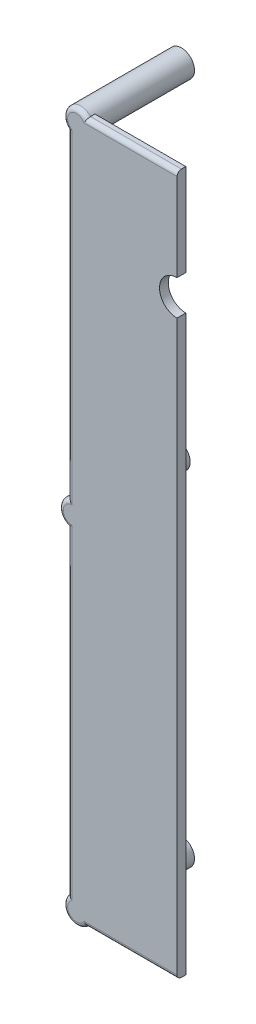
ISO-10303-21;
HEADER;
FILE_DESCRIPTION(('STEP AP214'),'2;1');
FILE_NAME('part.step','',(''),(''),'','','');
FILE_SCHEMA(('AUTOMOTIVE_DESIGN { 1 0 10303 214 1 1 1 1 }'));
ENDSEC;
DATA;
#1=APPLICATION_CONTEXT('core data for automotive mechanical design processes');
#2=APPLICATION_PROTOCOL_DEFINITION('international standard','automotive_design',2000,#1);
#3=PRODUCT_CONTEXT('',#1,'mechanical');
#4=PRODUCT('Part','Part','',(#3));
#5=PRODUCT_RELATED_PRODUCT_CATEGORY('part','',(#4));
#6=PRODUCT_DEFINITION_FORMATION('','',#4);
#7=PRODUCT_DEFINITION_CONTEXT('part definition',#1,'design');
#8=PRODUCT_DEFINITION('design','',#6,#7);
#9=PRODUCT_DEFINITION_SHAPE('','',#8);
#10=(LENGTH_UNIT() NAMED_UNIT(*) SI_UNIT(.MILLI.,.METRE.));
#11=(NAMED_UNIT(*) PLANE_ANGLE_UNIT() SI_UNIT($,.RADIAN.));
#12=(NAMED_UNIT(*) SI_UNIT($,.STERADIAN.) SOLID_ANGLE_UNIT());
#13=UNCERTAINTY_MEASURE_WITH_UNIT(LENGTH_MEASURE(1.E-05),#10,'distance_accuracy_value','');
#14=(GEOMETRIC_REPRESENTATION_CONTEXT(3) GLOBAL_UNCERTAINTY_ASSIGNED_CONTEXT((#13)) GLOBAL_UNIT_ASSIGNED_CONTEXT((#10,
#11,#12)) REPRESENTATION_CONTEXT('',''));
#15=CARTESIAN_POINT('',(0.,0.,0.));
#16=DIRECTION('',(0.,0.,1.));
#17=DIRECTION('',(1.,0.,0.));
#18=AXIS2_PLACEMENT_3D('',#15,#16,#17);
#19=CARTESIAN_POINT('',(2.,2.,50.));
#20=DIRECTION('',(0.,0.,1.));
#21=DIRECTION('',(1.,0.,0.));
#22=AXIS2_PLACEMENT_3D('',#19,#20,#21);
#23=PLANE('',#22);
#24=DIRECTION('',(0.,1.,0.));
#25=VECTOR('',#24,1.);
#26=CARTESIAN_POINT('',(25.,2.,50.));
#27=LINE('',#26,#25);
#28=CARTESIAN_POINT('',(25.,0.,50.));
#29=VERTEX_POINT('',#28);
#30=CARTESIAN_POINT('',(25.,131.,50.));
#31=VERTEX_POINT('',#30);
#32=EDGE_CURVE('E231',#29,#31,#27,.T.);
#33=ORIENTED_EDGE('',*,*,#32,.F.);
#34=DIRECTION('',(1.,0.,0.));
#35=VECTOR('',#34,1.);
#36=CARTESIAN_POINT('',(0.,0.,50.));
#37=LINE('',#36,#35);
#38=CARTESIAN_POINT('',(4.23606797749979,0.,50.));
#39=VERTEX_POINT('',#38);
#40=EDGE_CURVE('E270',#39,#29,#37,.T.);
#41=ORIENTED_EDGE('',*,*,#40,.F.);
#42=CARTESIAN_POINT('',(2.,2.,50.));
#43=DIRECTION('',(0.,0.,-1.));
#44=DIRECTION('',(-1.,0.,0.));
#45=AXIS2_PLACEMENT_3D('',#42,#43,#44);
#46=CIRCLE('',#45,3.);
#47=CARTESIAN_POINT('',(0.,4.23606797749979,50.));
#48=VERTEX_POINT('',#47);
#49=EDGE_CURVE('E249',#48,#39,#46,.T.);
#50=ORIENTED_EDGE('',*,*,#49,.F.);
#51=DIRECTION('',(0.,-1.,0.));
#52=VECTOR('',#51,1.);
#53=CARTESIAN_POINT('',(0.,0.,50.));
#54=LINE('',#53,#52);
#55=CARTESIAN_POINT('',(0.,77.1715728752538,50.));
#56=VERTEX_POINT('',#55);
#57=EDGE_CURVE('E275',#56,#48,#54,.T.);
#58=ORIENTED_EDGE('',*,*,#57,.F.);
#59=CARTESIAN_POINT('',(0.999999999999973,80.,50.));
#60=DIRECTION('',(0.,0.,-1.));
#61=DIRECTION('',(-1.,0.,0.));
#62=AXIS2_PLACEMENT_3D('',#59,#60,#61);
#63=CIRCLE('',#62,3.);
#64=CARTESIAN_POINT('',(0.,82.8284271247462,50.));
#65=VERTEX_POINT('',#64);
#66=EDGE_CURVE('E258',#65,#56,#63,.T.);
#67=ORIENTED_EDGE('',*,*,#66,.F.);
#68=DIRECTION('',(0.,-1.,0.));
#69=VECTOR('',#68,1.);
#70=CARTESIAN_POINT('',(0.,0.,50.));
#71=LINE('',#70,#69);
#72=CARTESIAN_POINT('',(0.,155.7639320225,50.));
#73=VERTEX_POINT('',#72);
#74=EDGE_CURVE('E278',#73,#65,#71,.T.);
#75=ORIENTED_EDGE('',*,*,#74,.F.);
#76=CARTESIAN_POINT('',(1.99999999999997,158.,50.));
#77=DIRECTION('',(0.,0.,-1.));
#78=DIRECTION('',(-1.,0.,0.));
#79=AXIS2_PLACEMENT_3D('',#76,#77,#78);
#80=CIRCLE('',#79,3.);
#81=CARTESIAN_POINT('',(4.23606797749976,160.,50.));
#82=VERTEX_POINT('',#81);
#83=EDGE_CURVE('E264',#82,#73,#80,.T.);
#84=ORIENTED_EDGE('',*,*,#83,.F.);
#85=DIRECTION('',(-1.,0.,0.));
#86=VECTOR('',#85,1.);
#87=CARTESIAN_POINT('',(0.,160.,50.));
#88=LINE('',#87,#86);
#89=CARTESIAN_POINT('',(25.,160.,50.));
#90=VERTEX_POINT('',#89);
#91=EDGE_CURVE('E281',#90,#82,#88,.T.);
#92=ORIENTED_EDGE('',*,*,#91,.F.);
#93=CARTESIAN_POINT('',(25.,139.,50.));
#94=VERTEX_POINT('',#93);
#95=EDGE_CURVE('E251',#94,#90,#27,.T.);
#96=ORIENTED_EDGE('',*,*,#95,.F.);
#97=CARTESIAN_POINT('',(25.,135.,50.));
#98=DIRECTION('',(0.,0.,1.));
#99=DIRECTION('',(1.,0.,0.));
#100=AXIS2_PLACEMENT_3D('',#97,#98,#99);
#101=CIRCLE('',#100,4.);
#102=EDGE_CURVE('E246',#94,#31,#101,.T.);
#103=ORIENTED_EDGE('',*,*,#102,.T.);
#104=EDGE_LOOP('',(#33,#41,#50,#58,#67,#75,#84,#92,#96,#103));
#105=FACE_BOUND('',#104,.T.);
#106=ADVANCED_FACE('F112',(#105),#23,.F.);
#107=CARTESIAN_POINT('',(2.,2.,52.));
#108=DIRECTION('',(0.,0.,1.));
#109=DIRECTION('',(1.,0.,0.));
#110=AXIS2_PLACEMENT_3D('',#107,#108,#109);
#111=PLANE('',#110);
#112=CARTESIAN_POINT('',(2.,2.,52.));
#113=DIRECTION('',(0.,0.,1.));
#114=DIRECTION('',(1.,0.,0.));
#115=AXIS2_PLACEMENT_3D('',#112,#113,#114);
#116=CIRCLE('',#115,2.);
#117=CARTESIAN_POINT('',(0.999999999999999,3.73205080756888,52.));
#118=VERTEX_POINT('',#117);
#119=CARTESIAN_POINT('',(3.73205080756888,1.,52.));
#120=VERTEX_POINT('',#119);
#121=EDGE_CURVE('E307',#118,#120,#116,.T.);
#122=ORIENTED_EDGE('',*,*,#121,.T.);
#123=DIRECTION('',(1.,0.,0.));
#124=VECTOR('',#123,1.);
#125=CARTESIAN_POINT('',(25.,1.,52.));
#126=LINE('',#125,#124);
#127=CARTESIAN_POINT('',(25.,1.,52.));
#128=VERTEX_POINT('',#127);
#129=EDGE_CURVE('E229',#120,#128,#126,.T.);
#130=ORIENTED_EDGE('',*,*,#129,.T.);
#131=DIRECTION('',(0.,1.,0.));
#132=VECTOR('',#131,1.);
#133=CARTESIAN_POINT('',(25.,2.,52.));
#134=LINE('',#133,#132);
#135=CARTESIAN_POINT('',(25.,131.,52.));
#136=VERTEX_POINT('',#135);
#137=EDGE_CURVE('E222',#128,#136,#134,.T.);
#138=ORIENTED_EDGE('',*,*,#137,.T.);
#139=CARTESIAN_POINT('',(25.,135.,52.));
#140=DIRECTION('',(0.,0.,1.));
#141=DIRECTION('',(1.,0.,0.));
#142=AXIS2_PLACEMENT_3D('',#139,#140,#141);
#143=CIRCLE('',#142,4.);
#144=CARTESIAN_POINT('',(25.,139.,52.));
#145=VERTEX_POINT('',#144);
#146=EDGE_CURVE('E227',#145,#136,#143,.T.);
#147=ORIENTED_EDGE('',*,*,#146,.F.);
#148=CARTESIAN_POINT('',(25.,159.,52.));
#149=VERTEX_POINT('',#148);
#150=EDGE_CURVE('E233',#145,#149,#134,.T.);
#151=ORIENTED_EDGE('',*,*,#150,.T.);
#152=DIRECTION('',(-1.,0.,0.));
#153=VECTOR('',#152,1.);
#154=CARTESIAN_POINT('',(4.23606797749976,159.,52.));
#155=LINE('',#154,#153);
#156=CARTESIAN_POINT('',(3.73205080756885,159.,52.));
#157=VERTEX_POINT('',#156);
#158=EDGE_CURVE('E297',#149,#157,#155,.T.);
#159=ORIENTED_EDGE('',*,*,#158,.T.);
#160=CARTESIAN_POINT('',(1.99999999999997,158.,52.));
#161=DIRECTION('',(0.,0.,1.));
#162=DIRECTION('',(1.,0.,0.));
#163=AXIS2_PLACEMENT_3D('',#160,#161,#162);
#164=CIRCLE('',#163,2.);
#165=CARTESIAN_POINT('',(0.999999999999976,156.267949192431,52.));
#166=VERTEX_POINT('',#165);
#167=EDGE_CURVE('E299',#157,#166,#164,.T.);
#168=ORIENTED_EDGE('',*,*,#167,.T.);
#169=DIRECTION('',(0.,-1.,0.));
#170=VECTOR('',#169,1.);
#171=CARTESIAN_POINT('',(0.999999999999985,82.8284271247462,52.));
#172=LINE('',#171,#170);
#173=CARTESIAN_POINT('',(0.999999999999986,82.,52.));
#174=VERTEX_POINT('',#173);
#175=EDGE_CURVE('E301',#166,#174,#172,.T.);
#176=ORIENTED_EDGE('',*,*,#175,.T.);
#177=CARTESIAN_POINT('',(0.999999999999973,80.,52.));
#178=DIRECTION('',(0.,0.,1.));
#179=DIRECTION('',(1.,0.,0.));
#180=AXIS2_PLACEMENT_3D('',#177,#178,#179);
#181=CIRCLE('',#180,2.);
#182=CARTESIAN_POINT('',(0.999999999999986,78.,52.));
#183=VERTEX_POINT('',#182);
#184=EDGE_CURVE('E303',#174,#183,#181,.T.);
#185=ORIENTED_EDGE('',*,*,#184,.T.);
#186=DIRECTION('',(0.,-1.,0.));
#187=VECTOR('',#186,1.);
#188=CARTESIAN_POINT('',(0.999999999999999,4.23606797749979,52.));
#189=LINE('',#188,#187);
#190=EDGE_CURVE('E305',#183,#118,#189,.T.);
#191=ORIENTED_EDGE('',*,*,#190,.T.);
#192=EDGE_LOOP('',(#122,#130,#138,#147,#151,#159,#168,#176,#185,#191));
#193=FACE_BOUND('',#192,.T.);
#194=ADVANCED_FACE('F224',(#193),#111,.T.);
#195=CARTESIAN_POINT('',(0.,160.,50.));
#196=DIRECTION('',(0.,-1.,0.));
#197=DIRECTION('',(0.,0.,-1.));
#198=AXIS2_PLACEMENT_3D('',#195,#196,#197);
#199=PLANE('',#198);
#200=DIRECTION('',(0.,0.,1.));
#201=VECTOR('',#200,1.);
#202=CARTESIAN_POINT('',(4.23606797749976,160.,0.));
#203=LINE('',#202,#201);
#204=CARTESIAN_POINT('',(4.23606797749976,160.,51.));
#205=VERTEX_POINT('',#204);
#206=EDGE_CURVE('E293',#82,#205,#203,.T.);
#207=ORIENTED_EDGE('',*,*,#206,.T.);
#208=DIRECTION('',(-1.,0.,0.));
#209=VECTOR('',#208,1.);
#210=CARTESIAN_POINT('',(25.,160.,51.));
#211=LINE('',#210,#209);
#212=CARTESIAN_POINT('',(25.,160.,51.));
#213=VERTEX_POINT('',#212);
#214=EDGE_CURVE('E126',#205,#213,#211,.F.);
#215=ORIENTED_EDGE('',*,*,#214,.T.);
#216=DIRECTION('',(0.,0.,1.));
#217=VECTOR('',#216,1.);
#218=CARTESIAN_POINT('',(25.,160.,50.));
#219=LINE('',#218,#217);
#220=EDGE_CURVE('E247',#90,#213,#219,.T.);
#221=ORIENTED_EDGE('',*,*,#220,.F.);
#222=ORIENTED_EDGE('',*,*,#91,.T.);
#223=EDGE_LOOP('',(#207,#215,#221,#222));
#224=FACE_BOUND('',#223,.T.);
#225=ADVANCED_FACE('F397',(#224),#199,.F.);
#226=CARTESIAN_POINT('',(0.,0.,50.));
#227=DIRECTION('',(0.,1.,0.));
#228=DIRECTION('',(0.,0.,1.));
#229=AXIS2_PLACEMENT_3D('',#226,#227,#228);
#230=PLANE('',#229);
#231=DIRECTION('',(0.,0.,-1.));
#232=VECTOR('',#231,1.);
#233=CARTESIAN_POINT('',(25.,0.,50.));
#234=LINE('',#233,#232);
#235=CARTESIAN_POINT('',(25.,0.,51.));
#236=VERTEX_POINT('',#235);
#237=EDGE_CURVE('E453',#236,#29,#234,.T.);
#238=ORIENTED_EDGE('',*,*,#237,.F.);
#239=DIRECTION('',(1.,0.,0.));
#240=VECTOR('',#239,1.);
#241=CARTESIAN_POINT('',(4.23606797749979,0.,51.));
#242=LINE('',#241,#240);
#243=CARTESIAN_POINT('',(4.23606797749979,0.,51.));
#244=VERTEX_POINT('',#243);
#245=EDGE_CURVE('E312',#236,#244,#242,.F.);
#246=ORIENTED_EDGE('',*,*,#245,.T.);
#247=DIRECTION('',(0.,0.,1.));
#248=VECTOR('',#247,1.);
#249=CARTESIAN_POINT('',(4.23606797749979,0.,0.));
#250=LINE('',#249,#248);
#251=EDGE_CURVE('E283',#244,#39,#250,.F.);
#252=ORIENTED_EDGE('',*,*,#251,.T.);
#253=ORIENTED_EDGE('',*,*,#40,.T.);
#254=EDGE_LOOP('',(#238,#246,#252,#253));
#255=FACE_BOUND('',#254,.T.);
#256=ADVANCED_FACE('F416',(#255),#230,.F.);
#257=CARTESIAN_POINT('',(25.,135.,30.));
#258=DIRECTION('',(0.,0.,1.));
#259=DIRECTION('',(1.,0.,0.));
#260=AXIS2_PLACEMENT_3D('',#257,#258,#259);
#261=CYLINDRICAL_SURFACE('',#260,4.);
#262=DIRECTION('',(0.,0.,1.));
#263=VECTOR('',#262,1.);
#264=CARTESIAN_POINT('',(25.,139.,30.));
#265=LINE('',#264,#263);
#266=EDGE_CURVE('E241',#145,#94,#265,.F.);
#267=ORIENTED_EDGE('',*,*,#266,.F.);
#268=ORIENTED_EDGE('',*,*,#146,.T.);
#269=DIRECTION('',(0.,0.,1.));
#270=VECTOR('',#269,1.);
#271=CARTESIAN_POINT('',(25.,131.,30.));
#272=LINE('',#271,#270);
#273=EDGE_CURVE('E235',#31,#136,#272,.T.);
#274=ORIENTED_EDGE('',*,*,#273,.F.);
#275=ORIENTED_EDGE('',*,*,#102,.F.);
#276=EDGE_LOOP('',(#267,#268,#274,#275));
#277=FACE_BOUND('',#276,.T.);
#278=ADVANCED_FACE('F245',(#277),#261,.F.);
#279=CARTESIAN_POINT('',(0.,0.,50.));
#280=DIRECTION('',(1.,0.,0.));
#281=DIRECTION('',(0.,1.,0.));
#282=AXIS2_PLACEMENT_3D('',#279,#280,#281);
#283=PLANE('',#282);
#284=DIRECTION('',(0.,0.,1.));
#285=VECTOR('',#284,1.);
#286=CARTESIAN_POINT('',(0.,82.8284271247462,0.));
#287=LINE('',#286,#285);
#288=CARTESIAN_POINT('',(0.,82.8284271247462,51.));
#289=VERTEX_POINT('',#288);
#290=EDGE_CURVE('E290',#65,#289,#287,.T.);
#291=ORIENTED_EDGE('',*,*,#290,.T.);
#292=DIRECTION('',(0.,-1.,0.));
#293=VECTOR('',#292,1.);
#294=CARTESIAN_POINT('',(0.,155.7639320225,51.));
#295=LINE('',#294,#293);
#296=CARTESIAN_POINT('',(0.,155.7639320225,51.));
#297=VERTEX_POINT('',#296);
#298=EDGE_CURVE('E320',#289,#297,#295,.F.);
#299=ORIENTED_EDGE('',*,*,#298,.T.);
#300=DIRECTION('',(0.,0.,1.));
#301=VECTOR('',#300,1.);
#302=CARTESIAN_POINT('',(0.,155.7639320225,0.));
#303=LINE('',#302,#301);
#304=EDGE_CURVE('E242',#297,#73,#303,.F.);
#305=ORIENTED_EDGE('',*,*,#304,.T.);
#306=ORIENTED_EDGE('',*,*,#74,.T.);
#307=EDGE_LOOP('',(#291,#299,#305,#306));
#308=FACE_BOUND('',#307,.T.);
#309=ADVANCED_FACE('F420',(#308),#283,.F.);
#310=DIRECTION('',(0.,0.,1.));
#311=VECTOR('',#310,1.);
#312=CARTESIAN_POINT('',(0.,4.23606797749979,0.));
#313=LINE('',#312,#311);
#314=CARTESIAN_POINT('',(0.,4.23606797749979,51.));
#315=VERTEX_POINT('',#314);
#316=EDGE_CURVE('E285',#48,#315,#313,.T.);
#317=ORIENTED_EDGE('',*,*,#316,.T.);
#318=DIRECTION('',(0.,-1.,0.));
#319=VECTOR('',#318,1.);
#320=CARTESIAN_POINT('',(0.,77.1715728752538,51.));
#321=LINE('',#320,#319);
#322=CARTESIAN_POINT('',(0.,77.1715728752538,51.));
#323=VERTEX_POINT('',#322);
#324=EDGE_CURVE('E316',#315,#323,#321,.F.);
#325=ORIENTED_EDGE('',*,*,#324,.T.);
#326=DIRECTION('',(0.,0.,1.));
#327=VECTOR('',#326,1.);
#328=CARTESIAN_POINT('',(0.,77.1715728752538,0.));
#329=LINE('',#328,#327);
#330=EDGE_CURVE('E288',#323,#56,#329,.F.);
#331=ORIENTED_EDGE('',*,*,#330,.T.);
#332=ORIENTED_EDGE('',*,*,#57,.T.);
#333=EDGE_LOOP('',(#317,#325,#331,#332));
#334=FACE_BOUND('',#333,.T.);
#335=ADVANCED_FACE('F405',(#334),#283,.F.);
#336=CARTESIAN_POINT('',(2.,2.,0.));
#337=DIRECTION('',(0.,0.,1.));
#338=DIRECTION('',(1.,0.,0.));
#339=AXIS2_PLACEMENT_3D('',#336,#337,#338);
#340=CYLINDRICAL_SURFACE('',#339,3.);
#341=ORIENTED_EDGE('',*,*,#251,.F.);
#342=CARTESIAN_POINT('',(2.,2.,51.));
#343=DIRECTION('',(0.,0.,1.));
#344=DIRECTION('',(1.,0.,0.));
#345=AXIS2_PLACEMENT_3D('',#342,#343,#344);
#346=CIRCLE('',#345,3.);
#347=EDGE_CURVE('E314',#244,#315,#346,.F.);
#348=ORIENTED_EDGE('',*,*,#347,.T.);
#349=ORIENTED_EDGE('',*,*,#316,.F.);
#350=ORIENTED_EDGE('',*,*,#49,.T.);
#351=EDGE_LOOP('',(#341,#348,#349,#350));
#352=FACE_BOUND('',#351,.T.);
#353=CARTESIAN_POINT('',(2.,2.,28.));
#354=DIRECTION('',(0.,0.,-1.));
#355=DIRECTION('',(-1.,0.,0.));
#356=AXIS2_PLACEMENT_3D('',#353,#354,#355);
#357=CIRCLE('',#356,3.);
#358=CARTESIAN_POINT('',(-1.,2.,28.));
#359=VERTEX_POINT('',#358);
#360=EDGE_CURVE('E255',#359,#359,#357,.T.);
#361=ORIENTED_EDGE('',*,*,#360,.F.);
#362=EDGE_LOOP('',(#361));
#363=FACE_BOUND('',#362,.T.);
#364=ADVANCED_FACE('F401',(#352,#363),#340,.T.);
#365=CARTESIAN_POINT('',(0.999999999999973,80.,0.));
#366=DIRECTION('',(0.,0.,1.));
#367=DIRECTION('',(1.,0.,0.));
#368=AXIS2_PLACEMENT_3D('',#365,#366,#367);
#369=CYLINDRICAL_SURFACE('',#368,3.);
#370=ORIENTED_EDGE('',*,*,#330,.F.);
#371=CARTESIAN_POINT('',(0.999999999999973,80.,51.));
#372=DIRECTION('',(0.,0.,1.));
#373=DIRECTION('',(1.,0.,0.));
#374=AXIS2_PLACEMENT_3D('',#371,#372,#373);
#375=CIRCLE('',#374,3.);
#376=EDGE_CURVE('E318',#323,#289,#375,.F.);
#377=ORIENTED_EDGE('',*,*,#376,.T.);
#378=ORIENTED_EDGE('',*,*,#290,.F.);
#379=ORIENTED_EDGE('',*,*,#66,.T.);
#380=EDGE_LOOP('',(#370,#377,#378,#379));
#381=FACE_BOUND('',#380,.T.);
#382=CARTESIAN_POINT('',(0.999999999999973,80.,28.));
#383=DIRECTION('',(0.,0.,-1.));
#384=DIRECTION('',(-1.,0.,0.));
#385=AXIS2_PLACEMENT_3D('',#382,#383,#384);
#386=CIRCLE('',#385,3.);
#387=CARTESIAN_POINT('',(-2.00000000000003,80.,28.));
#388=VERTEX_POINT('',#387);
#389=EDGE_CURVE('E261',#388,#388,#386,.T.);
#390=ORIENTED_EDGE('',*,*,#389,.F.);
#391=EDGE_LOOP('',(#390));
#392=FACE_BOUND('',#391,.T.);
#393=ADVANCED_FACE('F404',(#381,#392),#369,.T.);
#394=CARTESIAN_POINT('',(1.99999999999997,158.,0.));
#395=DIRECTION('',(0.,0.,1.));
#396=DIRECTION('',(1.,0.,0.));
#397=AXIS2_PLACEMENT_3D('',#394,#395,#396);
#398=CYLINDRICAL_SURFACE('',#397,3.);
#399=ORIENTED_EDGE('',*,*,#304,.F.);
#400=CARTESIAN_POINT('',(1.99999999999997,158.,51.));
#401=DIRECTION('',(0.,0.,1.));
#402=DIRECTION('',(1.,0.,0.));
#403=AXIS2_PLACEMENT_3D('',#400,#401,#402);
#404=CIRCLE('',#403,3.);
#405=EDGE_CURVE('E141',#297,#205,#404,.F.);
#406=ORIENTED_EDGE('',*,*,#405,.T.);
#407=ORIENTED_EDGE('',*,*,#206,.F.);
#408=ORIENTED_EDGE('',*,*,#83,.T.);
#409=EDGE_LOOP('',(#399,#406,#407,#408));
#410=FACE_BOUND('',#409,.T.);
#411=CARTESIAN_POINT('',(1.99999999999997,158.,28.));
#412=DIRECTION('',(0.,0.,-1.));
#413=DIRECTION('',(-1.,0.,0.));
#414=AXIS2_PLACEMENT_3D('',#411,#412,#413);
#415=CIRCLE('',#414,3.);
#416=CARTESIAN_POINT('',(-1.00000000000002,158.,28.));
#417=VERTEX_POINT('',#416);
#418=EDGE_CURVE('E267',#417,#417,#415,.T.);
#419=ORIENTED_EDGE('',*,*,#418,.F.);
#420=EDGE_LOOP('',(#419));
#421=FACE_BOUND('',#420,.T.);
#422=ADVANCED_FACE('F409',(#410,#421),#398,.T.);
#423=CARTESIAN_POINT('',(1.99999999999997,158.,28.));
#424=DIRECTION('',(0.,0.,-1.));
#425=DIRECTION('',(-1.,0.,0.));
#426=AXIS2_PLACEMENT_3D('',#423,#424,#425);
#427=PLANE('',#426);
#428=ORIENTED_EDGE('',*,*,#418,.T.);
#429=EDGE_LOOP('',(#428));
#430=FACE_BOUND('',#429,.T.);
#431=ADVANCED_FACE('F413',(#430),#427,.T.);
#432=CARTESIAN_POINT('',(0.999999999999973,80.,28.));
#433=DIRECTION('',(0.,0.,-1.));
#434=DIRECTION('',(-1.,0.,0.));
#435=AXIS2_PLACEMENT_3D('',#432,#433,#434);
#436=PLANE('',#435);
#437=ORIENTED_EDGE('',*,*,#389,.T.);
#438=EDGE_LOOP('',(#437));
#439=FACE_BOUND('',#438,.T.);
#440=ADVANCED_FACE('F467',(#439),#436,.T.);
#441=CARTESIAN_POINT('',(2.,2.,28.));
#442=DIRECTION('',(0.,0.,-1.));
#443=DIRECTION('',(-1.,0.,0.));
#444=AXIS2_PLACEMENT_3D('',#441,#442,#443);
#445=PLANE('',#444);
#446=ORIENTED_EDGE('',*,*,#360,.T.);
#447=EDGE_LOOP('',(#446));
#448=FACE_BOUND('',#447,.T.);
#449=ADVANCED_FACE('F471',(#448),#445,.T.);
#450=CARTESIAN_POINT('',(25.,0.,0.));
#451=DIRECTION('',(1.,0.,0.));
#452=DIRECTION('',(0.,0.,-1.));
#453=AXIS2_PLACEMENT_3D('',#450,#451,#452);
#454=PLANE('',#453);
#455=ORIENTED_EDGE('',*,*,#137,.F.);
#456=CARTESIAN_POINT('',(25.,1.,51.));
#457=DIRECTION('',(1.,0.,0.));
#458=DIRECTION('',(0.,0.,-1.));
#459=AXIS2_PLACEMENT_3D('',#456,#457,#458);
#460=CIRCLE('',#459,1.);
#461=EDGE_CURVE('E310',#128,#236,#460,.T.);
#462=ORIENTED_EDGE('',*,*,#461,.T.);
#463=ORIENTED_EDGE('',*,*,#237,.T.);
#464=ORIENTED_EDGE('',*,*,#32,.T.);
#465=ORIENTED_EDGE('',*,*,#273,.T.);
#466=EDGE_LOOP('',(#455,#462,#463,#464,#465));
#467=FACE_BOUND('',#466,.T.);
#468=ADVANCED_FACE('F236',(#467),#454,.T.);
#469=ORIENTED_EDGE('',*,*,#220,.T.);
#470=CARTESIAN_POINT('',(25.,159.,51.));
#471=DIRECTION('',(1.,0.,0.));
#472=DIRECTION('',(0.,0.,-1.));
#473=AXIS2_PLACEMENT_3D('',#470,#471,#472);
#474=CIRCLE('',#473,1.);
#475=EDGE_CURVE('E13',#213,#149,#474,.T.);
#476=ORIENTED_EDGE('',*,*,#475,.T.);
#477=ORIENTED_EDGE('',*,*,#150,.F.);
#478=ORIENTED_EDGE('',*,*,#266,.T.);
#479=ORIENTED_EDGE('',*,*,#95,.T.);
#480=EDGE_LOOP('',(#469,#476,#477,#478,#479));
#481=FACE_BOUND('',#480,.T.);
#482=ADVANCED_FACE('F388',(#481),#454,.T.);
#483=CARTESIAN_POINT('',(2.,159.,51.));
#484=DIRECTION('',(1.,0.,0.));
#485=DIRECTION('',(0.,0.,-1.));
#486=AXIS2_PLACEMENT_3D('',#483,#484,#485);
#487=CYLINDRICAL_SURFACE('',#486,1.);
#488=ORIENTED_EDGE('',*,*,#475,.F.);
#489=ORIENTED_EDGE('',*,*,#214,.F.);
#490=CARTESIAN_POINT('',(4.23606797749976,160.,51.));
#491=CARTESIAN_POINT('',(4.23606793956587,160.000000958065,51.0262761337896));
#492=CARTESIAN_POINT('',(4.23560453469334,159.998963594621,51.0525391008307));
#493=CARTESIAN_POINT('',(4.23375620885161,159.994832769189,51.1048650273615));
#494=CARTESIAN_POINT('',(4.2323714704562,159.991739714561,51.1309280254427));
#495=CARTESIAN_POINT('',(4.22685627901449,159.979437259157,51.2083830396057));
#496=CARTESIAN_POINT('',(4.22136474999552,159.967204222097,51.2592356513197));
#497=CARTESIAN_POINT('',(4.20690597433165,159.935191179809,51.3579286158092));
#498=CARTESIAN_POINT('',(4.19793957632567,159.915413017284,51.4057697007518));
#499=CARTESIAN_POINT('',(4.17676539644922,159.869097882473,51.4972922287611));
#500=CARTESIAN_POINT('',(4.16455643229231,159.842558445072,51.5409721466976));
#501=CARTESIAN_POINT('',(4.13677011831416,159.78279404117,51.6244598568639));
#502=CARTESIAN_POINT('',(4.12110075664489,159.749388631186,51.6641073334328));
#503=CARTESIAN_POINT('',(4.08698430061042,159.677606331068,51.737208255102));
#504=CARTESIAN_POINT('',(4.06853650693876,159.639228189682,51.7706601360866));
#505=CARTESIAN_POINT('',(4.02764141100471,159.555439589477,51.8333302696355));
#506=CARTESIAN_POINT('',(4.00499171179224,159.509711743303,51.8619910990095));
#507=CARTESIAN_POINT('',(3.95730898884638,159.415244967295,51.9112700455775));
#508=CARTESIAN_POINT('',(3.93227428572005,159.366503924334,51.9318824426384));
#509=CARTESIAN_POINT('',(3.87953296595842,159.265964570219,51.9654804296597));
#510=CARTESIAN_POINT('',(3.85177091316817,159.214118805714,51.9782345742394));
#511=CARTESIAN_POINT('',(3.79467011170553,159.110014229644,51.9953251013182));
#512=CARTESIAN_POINT('',(3.76533436771409,159.057756357059,51.999676977027));
#513=CARTESIAN_POINT('',(3.73431532186289,159.003924167277,51.9999942395109));
#514=CARTESIAN_POINT('',(3.73318345312102,159.001961787951,52.0000000133747));
#515=CARTESIAN_POINT('',(3.73205080756885,159.,52.));
#516=B_SPLINE_CURVE_WITH_KNOTS('',3,(#490,#491,#492,#493,#494,#495,#496,#497,#498,#499,#500,
#501,#502,#503,#504,#505,#506,#507,#508,#509,#510,#511,#512,#513,#514,#515),.UNSPECIFIED.,.F.,
.F.,(4,2,2,2,2,2,2,2,2,2,2,2,4),(0.,0.0787779861353128,0.157540366072871,0.314489126943972,
0.471399581629591,0.628367326863109,0.790160530661868,0.951994524623878,1.12685345558582,
1.30183643600641,1.48175349087446,1.66133847295153,1.66813467263543),.UNSPECIFIED.);
#517=EDGE_CURVE('E117',#157,#205,#516,.F.);
#518=ORIENTED_EDGE('',*,*,#517,.F.);
#519=ORIENTED_EDGE('',*,*,#158,.F.);
#520=EDGE_LOOP('',(#488,#489,#518,#519));
#521=FACE_BOUND('',#520,.T.);
#522=ADVANCED_FACE('F114',(#521),#487,.T.);
#523=CARTESIAN_POINT('',(1.99999999999997,158.,51.));
#524=DIRECTION('',(0.,0.,1.));
#525=DIRECTION('',(1.,0.,0.));
#526=AXIS2_PLACEMENT_3D('',#523,#524,#525);
#527=TOROIDAL_SURFACE('',#526,2.,1.);
#528=ORIENTED_EDGE('',*,*,#517,.T.);
#529=ORIENTED_EDGE('',*,*,#405,.F.);
#530=CARTESIAN_POINT('',(0.,155.7639320225,51.));
#531=CARTESIAN_POINT('',(-9.5806459221234E-07,155.763932060434,51.0262761337896));
#532=CARTESIAN_POINT('',(0.00103640537858079,155.764395465307,51.0525391008307));
#533=CARTESIAN_POINT('',(0.00516723081098938,155.766243791148,51.1048650273615));
#534=CARTESIAN_POINT('',(0.00826028543911742,155.767628529544,51.1309280254427));
#535=CARTESIAN_POINT('',(0.0205627408432936,155.773143720985,51.2083830396057));
#536=CARTESIAN_POINT('',(0.0327957779033056,155.778635250004,51.2592356513197));
#537=CARTESIAN_POINT('',(0.0648088201911056,155.793094025668,51.3579286158092));
#538=CARTESIAN_POINT('',(0.0845869827160169,155.802060423674,51.4057697007518));
#539=CARTESIAN_POINT('',(0.130902117527262,155.823234603551,51.4972922287611));
#540=CARTESIAN_POINT('',(0.157441554927864,155.835443567708,51.5409721466976));
#541=CARTESIAN_POINT('',(0.217205958829783,155.863229881686,51.6244598568639));
#542=CARTESIAN_POINT('',(0.250611368813551,155.878899243355,51.6641073334328));
#543=CARTESIAN_POINT('',(0.322393668932118,155.91301569939,51.737208255102));
#544=CARTESIAN_POINT('',(0.360771810318203,155.931463493061,51.7706601360866));
#545=CARTESIAN_POINT('',(0.444560410522828,155.972358588995,51.8333302696355));
#546=CARTESIAN_POINT('',(0.490288256697313,155.995008288208,51.8619910990095));
#547=CARTESIAN_POINT('',(0.584755032705366,156.042691011154,51.9112700455775));
#548=CARTESIAN_POINT('',(0.633496075665595,156.06772571428,51.9318824426384));
#549=CARTESIAN_POINT('',(0.734035429780546,156.120467034042,51.9654804296597));
#550=CARTESIAN_POINT('',(0.785881194286002,156.148229086832,51.9782345742394));
#551=CARTESIAN_POINT('',(0.889985770355404,156.205329888295,51.9953251013182));
#552=CARTESIAN_POINT('',(0.942243642940566,156.234665632286,51.999676977027));
#553=CARTESIAN_POINT('',(0.996075832722971,156.265684678137,51.9999942395109));
#554=CARTESIAN_POINT('',(0.998038212049448,156.266816546879,52.0000000133747));
#555=CARTESIAN_POINT('',(0.999999999999973,156.267949192431,52.));
#556=B_SPLINE_CURVE_WITH_KNOTS('',3,(#530,#531,#532,#533,#534,#535,#536,#537,#538,#539,#540,
#541,#542,#543,#544,#545,#546,#547,#548,#549,#550,#551,#552,#553,#554,#555),.UNSPECIFIED.,.F.,
.F.,(4,2,2,2,2,2,2,2,2,2,2,2,4),(0.,0.078777986135312,0.157540366072863,0.314489126943977,
0.471399581629592,0.628367326863115,0.790160530661889,0.951994524623866,1.12685345558582,
1.30183643600642,1.48175349087443,1.66133847295156,1.66813467263542),.UNSPECIFIED.);
#557=EDGE_CURVE('E370',#166,#297,#556,.F.);
#558=ORIENTED_EDGE('',*,*,#557,.F.);
#559=ORIENTED_EDGE('',*,*,#167,.F.);
#560=EDGE_LOOP('',(#528,#529,#558,#559));
#561=FACE_BOUND('',#560,.T.);
#562=ADVANCED_FACE('F378',(#561),#527,.T.);
#563=CARTESIAN_POINT('',(1.,2.,51.));
#564=DIRECTION('',(0.,1.,0.));
#565=DIRECTION('',(-1.,0.,0.));
#566=AXIS2_PLACEMENT_3D('',#563,#564,#565);
#567=CYLINDRICAL_SURFACE('',#566,1.);
#568=ORIENTED_EDGE('',*,*,#557,.T.);
#569=ORIENTED_EDGE('',*,*,#298,.F.);
#570=CARTESIAN_POINT('',(0.,82.8284271247462,51.));
#571=CARTESIAN_POINT('',(-1.92209738840747E-06,82.8284278051751,51.0242718999699));
#572=CARTESIAN_POINT('',(0.000884418910799137,82.8278018147085,51.0485307937647));
#573=CARTESIAN_POINT('',(0.00440633423642694,82.8253100695965,51.0968480931946));
#574=CARTESIAN_POINT('',(0.00704124329261334,82.823444786453,51.1209065715564));
#575=CARTESIAN_POINT('',(0.0174885362871063,82.8160382716308,51.1922716291847));
#576=CARTESIAN_POINT('',(0.0278442013467158,82.8086859924729,51.2390520380716));
#577=CARTESIAN_POINT('',(0.0547352458681728,82.7894712423128,51.3297171723663));
#578=CARTESIAN_POINT('',(0.0712640427772848,82.7776135752766,51.3736049238434));
#579=CARTESIAN_POINT('',(0.109655690159153,82.7498308736149,51.4576272846555));
#580=CARTESIAN_POINT('',(0.131523786208559,82.733901838362,51.4977581490814));
#581=CARTESIAN_POINT('',(0.180963156843673,82.6974981043508,51.5756970806461));
#582=CARTESIAN_POINT('',(0.208785496096912,82.6768185769533,51.6132486649265));
#583=CARTESIAN_POINT('',(0.268140979218746,82.6320973387533,51.6829947687106));
#584=CARTESIAN_POINT('',(0.299674772546981,82.6080550393673,51.7151883482418));
#585=CARTESIAN_POINT('',(0.370849807701663,82.5529352093596,51.7789829688021));
#586=CARTESIAN_POINT('',(0.410970252759707,82.5213514243197,51.8096096817468));
#587=CARTESIAN_POINT('',(0.493462649835622,82.4550465492277,51.8636305132498));
#588=CARTESIAN_POINT('',(0.535837764175616,82.4203210021765,51.8870141418967));
#589=CARTESIAN_POINT('',(0.647858637378395,82.3263515895079,51.9390417972051));
#590=CARTESIAN_POINT('',(0.718369711725901,82.2650743851552,51.9621917157338));
#591=CARTESIAN_POINT('',(0.858371372042797,82.1378872683534,51.9925082317313));
#592=CARTESIAN_POINT('',(0.92786270671337,82.0719809839574,51.9996872054044));
#593=CARTESIAN_POINT('',(0.997017805714971,82.0029805374285,51.9999966672879));
#594=CARTESIAN_POINT('',(0.99850935491871,82.0014906552269,52.0000000004368));
#595=CARTESIAN_POINT('',(0.999999999999986,82.,52.));
#596=B_SPLINE_CURVE_WITH_KNOTS('',3,(#570,#571,#572,#573,#574,#575,#576,#577,#578,#579,#580,
#581,#582,#583,#584,#585,#586,#587,#588,#589,#590,#591,#592,#593,#594,#595),.UNSPECIFIED.,.F.,
.F.,(4,2,2,2,2,2,2,2,2,2,2,2,4),(0.,0.0727662358341335,0.145504802842183,0.290141264139484,
0.434623934555044,0.579249126723423,0.731985115133288,0.884747870344661,1.06271769267388,
1.24094407033486,1.52790311157199,1.81463970494203,1.82096426917183),.UNSPECIFIED.);
#597=EDGE_CURVE('E364',#174,#289,#596,.F.);
#598=ORIENTED_EDGE('',*,*,#597,.F.);
#599=ORIENTED_EDGE('',*,*,#175,.F.);
#600=EDGE_LOOP('',(#568,#569,#598,#599));
#601=FACE_BOUND('',#600,.T.);
#602=ADVANCED_FACE('F375',(#601),#567,.T.);
#603=CARTESIAN_POINT('',(0.999999999999973,80.,51.));
#604=DIRECTION('',(0.,0.,1.));
#605=DIRECTION('',(1.,0.,0.));
#606=AXIS2_PLACEMENT_3D('',#603,#604,#605);
#607=TOROIDAL_SURFACE('',#606,2.,1.);
#608=ORIENTED_EDGE('',*,*,#597,.T.);
#609=ORIENTED_EDGE('',*,*,#376,.F.);
#610=CARTESIAN_POINT('',(0.,77.1715728752538,51.));
#611=CARTESIAN_POINT('',(-1.92209738735437E-06,77.1715721948249,51.0242718999699));
#612=CARTESIAN_POINT('',(0.000884418910800257,77.1721981852916,51.0485307937647));
#613=CARTESIAN_POINT('',(0.00440633423642811,77.1746899304035,51.0968480931946));
#614=CARTESIAN_POINT('',(0.00704124329261448,77.176555213547,51.1209065715564));
#615=CARTESIAN_POINT('',(0.0174885362871074,77.1839617283693,51.1922716291847));
#616=CARTESIAN_POINT('',(0.0278442013467167,77.1913140075271,51.2390520380716));
#617=CARTESIAN_POINT('',(0.0547352458681737,77.2105287576872,51.3297171723663));
#618=CARTESIAN_POINT('',(0.0712640427772859,77.2223864247234,51.3736049238434));
#619=CARTESIAN_POINT('',(0.109655690159154,77.2501691263851,51.4576272846555));
#620=CARTESIAN_POINT('',(0.131523786208559,77.266098161638,51.4977581490814));
#621=CARTESIAN_POINT('',(0.180963156843674,77.3025018956492,51.5756970806461));
#622=CARTESIAN_POINT('',(0.208785496096915,77.3231814230468,51.6132486649265));
#623=CARTESIAN_POINT('',(0.26814097921875,77.3679026612467,51.6829947687106));
#624=CARTESIAN_POINT('',(0.299674772546983,77.3919449606327,51.7151883482418));
#625=CARTESIAN_POINT('',(0.370849807701663,77.4470647906404,51.7789829688021));
#626=CARTESIAN_POINT('',(0.410970252759707,77.4786485756803,51.8096096817468));
#627=CARTESIAN_POINT('',(0.493462649835621,77.5449534507723,51.8636305132498));
#628=CARTESIAN_POINT('',(0.535837764175617,77.5796789978235,51.8870141418967));
#629=CARTESIAN_POINT('',(0.647858637378396,77.6736484104921,51.9390417972051));
#630=CARTESIAN_POINT('',(0.718369711725902,77.7349256148448,51.9621917157338));
#631=CARTESIAN_POINT('',(0.858371372042798,77.8621127316467,51.9925082317313));
#632=CARTESIAN_POINT('',(0.92786270671337,77.9280190160426,51.9996872054044));
#633=CARTESIAN_POINT('',(0.997017805714971,77.9970194625715,51.9999966672879));
#634=CARTESIAN_POINT('',(0.998509354918711,77.9985093447731,52.0000000004368));
#635=CARTESIAN_POINT('',(0.999999999999986,78.,52.));
#636=B_SPLINE_CURVE_WITH_KNOTS('',3,(#610,#611,#612,#613,#614,#615,#616,#617,#618,#619,#620,
#621,#622,#623,#624,#625,#626,#627,#628,#629,#630,#631,#632,#633,#634,#635),.UNSPECIFIED.,.F.,
.F.,(4,2,2,2,2,2,2,2,2,2,2,2,4),(0.,0.0727662358341335,0.145504802842183,0.290141264139484,
0.434623934555044,0.579249126723423,0.731985115133289,0.884747870344661,1.06271769267388,
1.24094407033486,1.52790311157199,1.81463970494203,1.82096426917183),.UNSPECIFIED.);
#637=EDGE_CURVE('E357',#183,#323,#636,.F.);
#638=ORIENTED_EDGE('',*,*,#637,.F.);
#639=ORIENTED_EDGE('',*,*,#184,.F.);
#640=EDGE_LOOP('',(#608,#609,#638,#639));
#641=FACE_BOUND('',#640,.T.);
#642=ADVANCED_FACE('F352',(#641),#607,.T.);
#643=CARTESIAN_POINT('',(1.,2.,51.));
#644=DIRECTION('',(0.,1.,0.));
#645=DIRECTION('',(-1.,0.,0.));
#646=AXIS2_PLACEMENT_3D('',#643,#644,#645);
#647=CYLINDRICAL_SURFACE('',#646,1.);
#648=ORIENTED_EDGE('',*,*,#637,.T.);
#649=ORIENTED_EDGE('',*,*,#324,.F.);
#650=CARTESIAN_POINT('',(0.,4.23606797749979,51.));
#651=CARTESIAN_POINT('',(-9.58064564866139E-07,4.23606793956589,51.0262761337896));
#652=CARTESIAN_POINT('',(0.00103640537860743,4.23560453469336,51.0525391008307));
#653=CARTESIAN_POINT('',(0.00516723081101522,4.23375620885164,51.1048650273615));
#654=CARTESIAN_POINT('',(0.00826028543914333,4.23237147045623,51.1309280254427));
#655=CARTESIAN_POINT('',(0.0205627408433198,4.22685627901452,51.2083830396057));
#656=CARTESIAN_POINT('',(0.0327957779033322,4.22136474999555,51.2592356513197));
#657=CARTESIAN_POINT('',(0.0648088201911325,4.20690597433168,51.3579286158092));
#658=CARTESIAN_POINT('',(0.0845869827160441,4.1979395763257,51.4057697007518));
#659=CARTESIAN_POINT('',(0.130902117527289,4.17676539644924,51.4972922287611));
#660=CARTESIAN_POINT('',(0.157441554927891,4.16455643229233,51.5409721466976));
#661=CARTESIAN_POINT('',(0.217205958829809,4.13677011831418,51.6244598568639));
#662=CARTESIAN_POINT('',(0.250611368813578,4.12110075664491,51.6641073334328));
#663=CARTESIAN_POINT('',(0.322393668932146,4.08698430061044,51.737208255102));
#664=CARTESIAN_POINT('',(0.360771810318233,4.06853650693879,51.7706601360866));
#665=CARTESIAN_POINT('',(0.444560410522857,4.02764141100474,51.8333302696355));
#666=CARTESIAN_POINT('',(0.490288256697338,4.00499171179226,51.8619910990095));
#667=CARTESIAN_POINT('',(0.584755032705398,3.9573089888464,51.9112700455775));
#668=CARTESIAN_POINT('',(0.633496075665637,3.93227428572006,51.9318824426384));
#669=CARTESIAN_POINT('',(0.73403542978057,3.87953296595846,51.9654804296597));
#670=CARTESIAN_POINT('',(0.785881194285999,3.85177091316823,51.9782345742394));
#671=CARTESIAN_POINT('',(0.889985770355485,3.79467011170552,51.9953251013182));
#672=CARTESIAN_POINT('',(0.942243642940759,3.76533436771398,51.999676977027));
#673=CARTESIAN_POINT('',(0.996075832722998,3.7343153218629,51.9999942395109));
#674=CARTESIAN_POINT('',(0.998038212049475,3.73318345312104,52.0000000133747));
#675=CARTESIAN_POINT('',(0.999999999999999,3.73205080756888,52.));
#676=B_SPLINE_CURVE_WITH_KNOTS('',3,(#650,#651,#652,#653,#654,#655,#656,#657,#658,#659,#660,
#661,#662,#663,#664,#665,#666,#667,#668,#669,#670,#671,#672,#673,#674,#675),.UNSPECIFIED.,.F.,
.F.,(4,2,2,2,2,2,2,2,2,2,2,2,4),(0.,0.0787779861353122,0.157540366072871,0.314489126943976,
0.471399581629589,0.628367326863117,0.790160530661894,0.951994524623866,1.12685345558582,
1.30183643600642,1.48175349087444,1.66133847295154,1.66813467263542),.UNSPECIFIED.);
#677=EDGE_CURVE('E333',#118,#315,#676,.F.);
#678=ORIENTED_EDGE('',*,*,#677,.F.);
#679=ORIENTED_EDGE('',*,*,#190,.F.);
#680=EDGE_LOOP('',(#648,#649,#678,#679));
#681=FACE_BOUND('',#680,.T.);
#682=ADVANCED_FACE('F346',(#681),#647,.T.);
#683=CARTESIAN_POINT('',(2.,2.,51.));
#684=DIRECTION('',(0.,0.,1.));
#685=DIRECTION('',(1.,0.,0.));
#686=AXIS2_PLACEMENT_3D('',#683,#684,#685);
#687=TOROIDAL_SURFACE('',#686,2.,1.);
#688=ORIENTED_EDGE('',*,*,#677,.T.);
#689=ORIENTED_EDGE('',*,*,#347,.F.);
#690=CARTESIAN_POINT('',(4.23606797749979,0.,51.));
#691=CARTESIAN_POINT('',(4.23606793956589,-9.58064564060234E-07,51.0262761337896));
#692=CARTESIAN_POINT('',(4.23560453469336,0.00103640537860825,51.0525391008307));
#693=CARTESIAN_POINT('',(4.23375620885164,0.00516723081101604,51.1048650273615));
#694=CARTESIAN_POINT('',(4.23237147045623,0.00826028543914415,51.1309280254427));
#695=CARTESIAN_POINT('',(4.22685627901452,0.0205627408433206,51.2083830396057));
#696=CARTESIAN_POINT('',(4.22136474999554,0.032795777903333,51.2592356513197));
#697=CARTESIAN_POINT('',(4.20690597433168,0.0648088201911333,51.3579286158092));
#698=CARTESIAN_POINT('',(4.1979395763257,0.084586982716045,51.4057697007518));
#699=CARTESIAN_POINT('',(4.17676539644924,0.13090211752729,51.4972922287611));
#700=CARTESIAN_POINT('',(4.16455643229233,0.157441554927892,51.5409721466976));
#701=CARTESIAN_POINT('',(4.13677011831418,0.21720595882981,51.6244598568639));
#702=CARTESIAN_POINT('',(4.12110075664491,0.250611368813578,51.6641073334328));
#703=CARTESIAN_POINT('',(4.08698430061044,0.322393668932147,51.737208255102));
#704=CARTESIAN_POINT('',(4.06853650693879,0.360771810318234,51.7706601360866));
#705=CARTESIAN_POINT('',(4.02764141100474,0.444560410522857,51.8333302696355));
#706=CARTESIAN_POINT('',(4.00499171179226,0.490288256697337,51.8619910990095));
#707=CARTESIAN_POINT('',(3.95730898884639,0.584755032705396,51.9112700455775));
#708=CARTESIAN_POINT('',(3.93227428572006,0.633496075665637,51.9318824426384));
#709=CARTESIAN_POINT('',(3.87953296595846,0.734035429780572,51.9654804296597));
#710=CARTESIAN_POINT('',(3.85177091316823,0.785881194286001,51.9782345742394));
#711=CARTESIAN_POINT('',(3.79467011170552,0.889985770355486,51.9953251013182));
#712=CARTESIAN_POINT('',(3.76533436771397,0.942243642940759,51.999676977027));
#713=CARTESIAN_POINT('',(3.7343153218629,0.996075832722999,51.9999942395109));
#714=CARTESIAN_POINT('',(3.73318345312104,0.998038212049476,52.0000000133747));
#715=CARTESIAN_POINT('',(3.73205080756888,1.,52.));
#716=B_SPLINE_CURVE_WITH_KNOTS('',3,(#690,#691,#692,#693,#694,#695,#696,#697,#698,#699,#700,
#701,#702,#703,#704,#705,#706,#707,#708,#709,#710,#711,#712,#713,#714,#715),.UNSPECIFIED.,.F.,
.F.,(4,2,2,2,2,2,2,2,2,2,2,2,4),(0.,0.0787779861353122,0.157540366072871,0.314489126943976,
0.47139958162959,0.628367326863117,0.790160530661894,0.951994524623865,1.12685345558582,
1.30183643600642,1.48175349087445,1.66133847295154,1.66813467263542),.UNSPECIFIED.);
#717=EDGE_CURVE('E324',#120,#244,#716,.F.);
#718=ORIENTED_EDGE('',*,*,#717,.F.);
#719=ORIENTED_EDGE('',*,*,#121,.F.);
#720=EDGE_LOOP('',(#688,#689,#718,#719));
#721=FACE_BOUND('',#720,.T.);
#722=ADVANCED_FACE('F343',(#721),#687,.T.);
#723=CARTESIAN_POINT('',(2.,1.,51.));
#724=DIRECTION('',(-1.,0.,0.));
#725=DIRECTION('',(0.,0.,1.));
#726=AXIS2_PLACEMENT_3D('',#723,#724,#725);
#727=CYLINDRICAL_SURFACE('',#726,1.);
#728=ORIENTED_EDGE('',*,*,#717,.T.);
#729=ORIENTED_EDGE('',*,*,#245,.F.);
#730=ORIENTED_EDGE('',*,*,#461,.F.);
#731=ORIENTED_EDGE('',*,*,#129,.F.);
#732=EDGE_LOOP('',(#728,#729,#730,#731));
#733=FACE_BOUND('',#732,.T.);
#734=ADVANCED_FACE('F340',(#733),#727,.T.);
#735=CLOSED_SHELL('',(#106,#194,#225,#256,#278,#309,#335,#364,#393,#422,#431,#440,#449,#468,
#482,#522,#562,#602,#642,#682,#722,#734));
#736=MANIFOLD_SOLID_BREP('B2',#735);
#737=ADVANCED_BREP_SHAPE_REPRESENTATION('',(#18,#736),#14);
#738=SHAPE_DEFINITION_REPRESENTATION(#9,#737);
ENDSEC;
END-ISO-10303-21;
